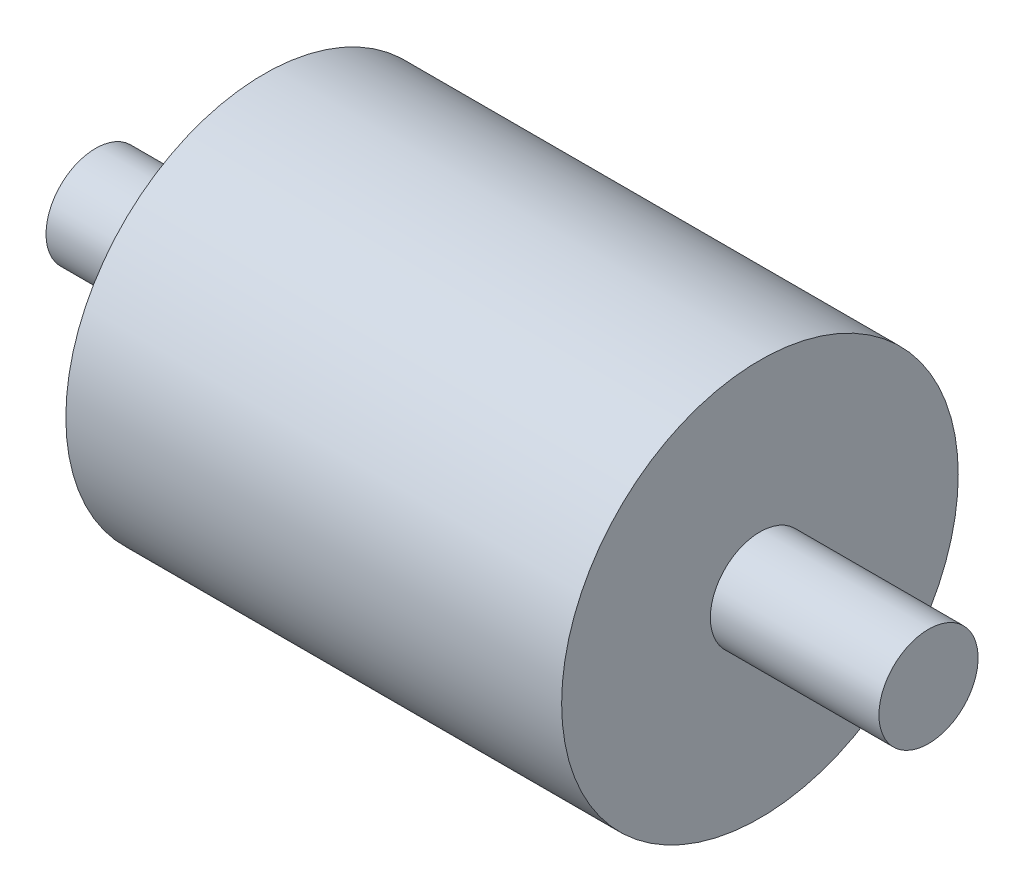
ISO-10303-21;
HEADER;
FILE_DESCRIPTION(('STEP AP214'),'2;1');
FILE_NAME('part.step','',(''),(''),'','','');
FILE_SCHEMA(('AUTOMOTIVE_DESIGN { 1 0 10303 214 1 1 1 1 }'));
ENDSEC;
DATA;
#1=APPLICATION_CONTEXT('core data for automotive mechanical design processes');
#2=APPLICATION_PROTOCOL_DEFINITION('international standard','automotive_design',2000,#1);
#3=PRODUCT_CONTEXT('',#1,'mechanical');
#4=PRODUCT('Part','Part','',(#3));
#5=PRODUCT_RELATED_PRODUCT_CATEGORY('part','',(#4));
#6=PRODUCT_DEFINITION_FORMATION('','',#4);
#7=PRODUCT_DEFINITION_CONTEXT('part definition',#1,'design');
#8=PRODUCT_DEFINITION('design','',#6,#7);
#9=PRODUCT_DEFINITION_SHAPE('','',#8);
#10=(LENGTH_UNIT() NAMED_UNIT(*) SI_UNIT(.MILLI.,.METRE.));
#11=(NAMED_UNIT(*) PLANE_ANGLE_UNIT() SI_UNIT($,.RADIAN.));
#12=(NAMED_UNIT(*) SI_UNIT($,.STERADIAN.) SOLID_ANGLE_UNIT());
#13=UNCERTAINTY_MEASURE_WITH_UNIT(LENGTH_MEASURE(1.E-05),#10,'distance_accuracy_value','');
#14=(GEOMETRIC_REPRESENTATION_CONTEXT(3) GLOBAL_UNCERTAINTY_ASSIGNED_CONTEXT((#13)) GLOBAL_UNIT_ASSIGNED_CONTEXT((#10,
#11,#12)) REPRESENTATION_CONTEXT('',''));
#15=CARTESIAN_POINT('',(0.,0.,0.));
#16=DIRECTION('',(0.,0.,1.));
#17=DIRECTION('',(1.,0.,0.));
#18=AXIS2_PLACEMENT_3D('',#15,#16,#17);
#19=CARTESIAN_POINT('',(25.,0.,0.));
#20=DIRECTION('',(-1.,0.,0.));
#21=DIRECTION('',(0.,0.,1.));
#22=AXIS2_PLACEMENT_3D('',#19,#20,#21);
#23=CYLINDRICAL_SURFACE('',#22,20.);
#24=CARTESIAN_POINT('',(25.,0.,0.));
#25=DIRECTION('',(1.,0.,0.));
#26=DIRECTION('',(0.,0.,-1.));
#27=AXIS2_PLACEMENT_3D('',#24,#25,#26);
#28=CIRCLE('',#27,20.);
#29=CARTESIAN_POINT('',(25.,0.,-20.));
#30=VERTEX_POINT('',#29);
#31=EDGE_CURVE('E44',#30,#30,#28,.T.);
#32=ORIENTED_EDGE('',*,*,#31,.F.);
#33=EDGE_LOOP('',(#32));
#34=FACE_BOUND('',#33,.T.);
#35=CARTESIAN_POINT('',(-25.,0.,0.));
#36=DIRECTION('',(1.,0.,0.));
#37=DIRECTION('',(0.,0.,-1.));
#38=AXIS2_PLACEMENT_3D('',#35,#36,#37);
#39=CIRCLE('',#38,20.);
#40=CARTESIAN_POINT('',(-25.,0.,-20.));
#41=VERTEX_POINT('',#40);
#42=EDGE_CURVE('E49',#41,#41,#39,.T.);
#43=ORIENTED_EDGE('',*,*,#42,.T.);
#44=EDGE_LOOP('',(#43));
#45=FACE_BOUND('',#44,.T.);
#46=ADVANCED_FACE('F37',(#34,#45),#23,.T.);
#47=CARTESIAN_POINT('',(25.,0.,0.));
#48=DIRECTION('',(1.,0.,0.));
#49=DIRECTION('',(0.,0.,-1.));
#50=AXIS2_PLACEMENT_3D('',#47,#48,#49);
#51=PLANE('',#50);
#52=CARTESIAN_POINT('',(25.,0.,0.));
#53=DIRECTION('',(1.,0.,0.));
#54=DIRECTION('',(0.,0.,-1.));
#55=AXIS2_PLACEMENT_3D('',#52,#53,#54);
#56=CIRCLE('',#55,5.);
#57=CARTESIAN_POINT('',(25.,0.,5.));
#58=VERTEX_POINT('',#57);
#59=EDGE_CURVE('E55',#58,#58,#56,.F.);
#60=ORIENTED_EDGE('',*,*,#59,.T.);
#61=EDGE_LOOP('',(#60));
#62=FACE_BOUND('',#61,.T.);
#63=ORIENTED_EDGE('',*,*,#31,.T.);
#64=EDGE_LOOP('',(#63));
#65=FACE_BOUND('',#64,.T.);
#66=ADVANCED_FACE('F87',(#62,#65),#51,.T.);
#67=CARTESIAN_POINT('',(-25.,0.,0.));
#68=DIRECTION('',(1.,0.,0.));
#69=DIRECTION('',(0.,0.,-1.));
#70=AXIS2_PLACEMENT_3D('',#67,#68,#69);
#71=PLANE('',#70);
#72=CARTESIAN_POINT('',(-25.,0.,0.));
#73=DIRECTION('',(1.,0.,0.));
#74=DIRECTION('',(0.,0.,-1.));
#75=AXIS2_PLACEMENT_3D('',#72,#73,#74);
#76=CIRCLE('',#75,5.);
#77=CARTESIAN_POINT('',(-25.,0.,5.));
#78=VERTEX_POINT('',#77);
#79=EDGE_CURVE('E10',#78,#78,#76,.F.);
#80=ORIENTED_EDGE('',*,*,#79,.F.);
#81=EDGE_LOOP('',(#80));
#82=FACE_BOUND('',#81,.T.);
#83=ORIENTED_EDGE('',*,*,#42,.F.);
#84=EDGE_LOOP('',(#83));
#85=FACE_BOUND('',#84,.T.);
#86=ADVANCED_FACE('F92',(#82,#85),#71,.F.);
#87=CARTESIAN_POINT('',(-42.,0.,0.));
#88=DIRECTION('',(1.,0.,0.));
#89=DIRECTION('',(0.,0.,-1.));
#90=AXIS2_PLACEMENT_3D('',#87,#88,#89);
#91=PLANE('',#90);
#92=CARTESIAN_POINT('',(-42.,0.,0.));
#93=DIRECTION('',(1.,0.,0.));
#94=DIRECTION('',(0.,0.,-1.));
#95=AXIS2_PLACEMENT_3D('',#92,#93,#94);
#96=CIRCLE('',#95,5.);
#97=CARTESIAN_POINT('',(-42.,0.,5.));
#98=VERTEX_POINT('',#97);
#99=EDGE_CURVE('E61',#98,#98,#96,.T.);
#100=ORIENTED_EDGE('',*,*,#99,.F.);
#101=EDGE_LOOP('',(#100));
#102=FACE_BOUND('',#101,.T.);
#103=ADVANCED_FACE('F81',(#102),#91,.F.);
#104=CARTESIAN_POINT('',(42.,0.,0.));
#105=DIRECTION('',(-1.,0.,0.));
#106=DIRECTION('',(0.,0.,1.));
#107=AXIS2_PLACEMENT_3D('',#104,#105,#106);
#108=CYLINDRICAL_SURFACE('',#107,5.);
#109=CARTESIAN_POINT('',(-42.,0.,5.));
#110=CARTESIAN_POINT('',(-41.8229166666667,0.,5.));
#111=CARTESIAN_POINT('',(-41.6458333333333,0.,5.));
#112=CARTESIAN_POINT('',(-41.2916666666667,0.,5.));
#113=CARTESIAN_POINT('',(-41.1145833333333,0.,5.));
#114=CARTESIAN_POINT('',(-40.7604166666667,0.,5.));
#115=CARTESIAN_POINT('',(-40.5833333333333,0.,5.));
#116=CARTESIAN_POINT('',(-40.2291666666667,0.,5.));
#117=CARTESIAN_POINT('',(-40.0520833333333,0.,5.));
#118=CARTESIAN_POINT('',(-39.6979166666667,0.,5.));
#119=CARTESIAN_POINT('',(-39.5208333333333,0.,5.));
#120=CARTESIAN_POINT('',(-39.1666666666667,0.,5.));
#121=CARTESIAN_POINT('',(-38.9895833333333,0.,5.));
#122=CARTESIAN_POINT('',(-38.6354166666667,0.,5.));
#123=CARTESIAN_POINT('',(-38.4583333333333,0.,5.));
#124=CARTESIAN_POINT('',(-38.1041666666667,0.,5.));
#125=CARTESIAN_POINT('',(-37.9270833333333,0.,5.));
#126=CARTESIAN_POINT('',(-37.5729166666667,0.,5.));
#127=CARTESIAN_POINT('',(-37.3958333333333,0.,5.));
#128=CARTESIAN_POINT('',(-37.0416666666667,0.,5.));
#129=CARTESIAN_POINT('',(-36.8645833333333,0.,5.));
#130=CARTESIAN_POINT('',(-36.5104166666667,0.,5.));
#131=CARTESIAN_POINT('',(-36.3333333333333,0.,5.));
#132=CARTESIAN_POINT('',(-35.9791666666667,0.,5.));
#133=CARTESIAN_POINT('',(-35.8020833333333,0.,5.));
#134=CARTESIAN_POINT('',(-35.4479166666667,0.,5.));
#135=CARTESIAN_POINT('',(-35.2708333333333,0.,5.));
#136=CARTESIAN_POINT('',(-34.9166666666667,0.,5.));
#137=CARTESIAN_POINT('',(-34.7395833333333,0.,5.));
#138=CARTESIAN_POINT('',(-34.3854166666667,0.,5.));
#139=CARTESIAN_POINT('',(-34.2083333333333,0.,5.));
#140=CARTESIAN_POINT('',(-33.8541666666667,0.,5.));
#141=CARTESIAN_POINT('',(-33.6770833333333,0.,5.));
#142=CARTESIAN_POINT('',(-33.3229166666667,0.,5.));
#143=CARTESIAN_POINT('',(-33.1458333333333,0.,5.));
#144=CARTESIAN_POINT('',(-32.7916666666667,0.,5.));
#145=CARTESIAN_POINT('',(-32.6145833333333,0.,5.));
#146=CARTESIAN_POINT('',(-32.2604166666667,0.,5.));
#147=CARTESIAN_POINT('',(-32.0833333333333,0.,5.));
#148=CARTESIAN_POINT('',(-31.7291666666667,0.,5.));
#149=CARTESIAN_POINT('',(-31.5520833333333,0.,5.));
#150=CARTESIAN_POINT('',(-31.1979166666667,0.,5.));
#151=CARTESIAN_POINT('',(-31.0208333333333,0.,5.));
#152=CARTESIAN_POINT('',(-30.6666666666667,0.,5.));
#153=CARTESIAN_POINT('',(-30.4895833333333,0.,5.));
#154=CARTESIAN_POINT('',(-30.1354166666667,0.,5.));
#155=CARTESIAN_POINT('',(-29.9583333333333,0.,5.));
#156=CARTESIAN_POINT('',(-29.6041666666667,0.,5.));
#157=CARTESIAN_POINT('',(-29.4270833333333,0.,5.));
#158=CARTESIAN_POINT('',(-29.0729166666667,0.,5.));
#159=CARTESIAN_POINT('',(-28.8958333333333,0.,5.));
#160=CARTESIAN_POINT('',(-28.5416666666667,0.,5.));
#161=CARTESIAN_POINT('',(-28.3645833333333,0.,5.));
#162=CARTESIAN_POINT('',(-28.0104166666667,0.,5.));
#163=CARTESIAN_POINT('',(-27.8333333333333,0.,5.));
#164=CARTESIAN_POINT('',(-27.4791666666667,0.,5.));
#165=CARTESIAN_POINT('',(-27.3020833333333,0.,5.));
#166=CARTESIAN_POINT('',(-26.9479166666667,0.,5.));
#167=CARTESIAN_POINT('',(-26.7708333333333,0.,5.));
#168=CARTESIAN_POINT('',(-26.4166666666667,0.,5.));
#169=CARTESIAN_POINT('',(-26.2395833333333,0.,5.));
#170=CARTESIAN_POINT('',(-25.8854166666667,0.,5.));
#171=CARTESIAN_POINT('',(-25.7083333333333,0.,5.));
#172=CARTESIAN_POINT('',(-25.3541666666667,0.,5.));
#173=CARTESIAN_POINT('',(-25.1770833333333,0.,5.));
#174=CARTESIAN_POINT('',(-25.,0.,5.));
#175=B_SPLINE_CURVE_WITH_KNOTS('',3,(#109,#110,#111,#112,#113,#114,#115,#116,#117,#118,#119,
#120,#121,#122,#123,#124,#125,#126,#127,#128,#129,#130,#131,#132,#133,#134,#135,#136,#137,#138,
#139,#140,#141,#142,#143,#144,#145,#146,#147,#148,#149,#150,#151,#152,#153,#154,#155,#156,#157,
#158,#159,#160,#161,#162,#163,#164,#165,#166,#167,#168,#169,#170,#171,#172,#173,#174),
.UNSPECIFIED.,.F.,.F.,(4,2,2,2,2,2,2,2,2,2,2,2,2,2,2,2,2,2,2,2,2,2,2,2,2,2,2,2,2,2,2,2,4),(0.,
0.531249999999997,1.06249999999999,1.59375,2.125,2.65625,3.1875,3.71874999999999,4.25,4.78125,
5.3125,5.84374999999999,6.37499999999999,6.90624999999999,7.4375,7.96875,8.49999999999999,
9.03124999999999,9.56249999999999,10.09375,10.625,11.15625,11.6875,12.21875,12.75,13.28125,
13.8125,14.34375,14.875,15.40625,15.9375,16.46875,17.),.UNSPECIFIED.);
#176=EDGE_CURVE('BSEAM73',#98,#78,#175,.T.);
#177=ORIENTED_EDGE('',*,*,#99,.T.);
#178=ORIENTED_EDGE('',*,*,#79,.T.);
#179=ORIENTED_EDGE('',*,*,#176,.T.);
#180=ORIENTED_EDGE('',*,*,#176,.F.);
#181=EDGE_LOOP('',(#177,#179,#178,#180));
#182=FACE_BOUND('',#181,.T.);
#183=ADVANCED_FACE('F73',(#182),#108,.T.);
#184=CARTESIAN_POINT('',(42.,0.,0.));
#185=DIRECTION('',(1.,0.,0.));
#186=DIRECTION('',(0.,0.,-1.));
#187=AXIS2_PLACEMENT_3D('',#184,#185,#186);
#188=CIRCLE('',#187,5.);
#189=CARTESIAN_POINT('',(42.,0.,5.));
#190=VERTEX_POINT('',#189);
#191=EDGE_CURVE('E60',#190,#190,#188,.T.);
#192=CARTESIAN_POINT('',(25.,0.,5.));
#193=CARTESIAN_POINT('',(25.1770833333333,0.,5.));
#194=CARTESIAN_POINT('',(25.3541666666667,0.,5.));
#195=CARTESIAN_POINT('',(25.7083333333333,0.,5.));
#196=CARTESIAN_POINT('',(25.8854166666667,0.,5.));
#197=CARTESIAN_POINT('',(26.2395833333333,0.,5.));
#198=CARTESIAN_POINT('',(26.4166666666667,0.,5.));
#199=CARTESIAN_POINT('',(26.7708333333333,0.,5.));
#200=CARTESIAN_POINT('',(26.9479166666667,0.,5.));
#201=CARTESIAN_POINT('',(27.3020833333333,0.,5.));
#202=CARTESIAN_POINT('',(27.4791666666667,0.,5.));
#203=CARTESIAN_POINT('',(27.8333333333333,0.,5.));
#204=CARTESIAN_POINT('',(28.0104166666667,0.,5.));
#205=CARTESIAN_POINT('',(28.3645833333333,0.,5.));
#206=CARTESIAN_POINT('',(28.5416666666667,0.,5.));
#207=CARTESIAN_POINT('',(28.8958333333333,0.,5.));
#208=CARTESIAN_POINT('',(29.0729166666667,0.,5.));
#209=CARTESIAN_POINT('',(29.4270833333333,0.,5.));
#210=CARTESIAN_POINT('',(29.6041666666667,0.,5.));
#211=CARTESIAN_POINT('',(29.9583333333333,0.,5.));
#212=CARTESIAN_POINT('',(30.1354166666667,0.,5.));
#213=CARTESIAN_POINT('',(30.4895833333333,0.,5.));
#214=CARTESIAN_POINT('',(30.6666666666667,0.,5.));
#215=CARTESIAN_POINT('',(31.0208333333333,0.,5.));
#216=CARTESIAN_POINT('',(31.1979166666667,0.,5.));
#217=CARTESIAN_POINT('',(31.5520833333333,0.,5.));
#218=CARTESIAN_POINT('',(31.7291666666667,0.,5.));
#219=CARTESIAN_POINT('',(32.0833333333333,0.,5.));
#220=CARTESIAN_POINT('',(32.2604166666667,0.,5.));
#221=CARTESIAN_POINT('',(32.6145833333333,0.,5.));
#222=CARTESIAN_POINT('',(32.7916666666667,0.,5.));
#223=CARTESIAN_POINT('',(33.1458333333333,0.,5.));
#224=CARTESIAN_POINT('',(33.3229166666667,0.,5.));
#225=CARTESIAN_POINT('',(33.6770833333333,0.,5.));
#226=CARTESIAN_POINT('',(33.8541666666667,0.,5.));
#227=CARTESIAN_POINT('',(34.2083333333333,0.,5.));
#228=CARTESIAN_POINT('',(34.3854166666667,0.,5.));
#229=CARTESIAN_POINT('',(34.7395833333333,0.,5.));
#230=CARTESIAN_POINT('',(34.9166666666667,0.,5.));
#231=CARTESIAN_POINT('',(35.2708333333333,0.,5.));
#232=CARTESIAN_POINT('',(35.4479166666667,0.,5.));
#233=CARTESIAN_POINT('',(35.8020833333333,0.,5.));
#234=CARTESIAN_POINT('',(35.9791666666667,0.,5.));
#235=CARTESIAN_POINT('',(36.3333333333333,0.,5.));
#236=CARTESIAN_POINT('',(36.5104166666667,0.,5.));
#237=CARTESIAN_POINT('',(36.8645833333333,0.,5.));
#238=CARTESIAN_POINT('',(37.0416666666667,0.,5.));
#239=CARTESIAN_POINT('',(37.3958333333333,0.,5.));
#240=CARTESIAN_POINT('',(37.5729166666667,0.,5.));
#241=CARTESIAN_POINT('',(37.9270833333333,0.,5.));
#242=CARTESIAN_POINT('',(38.1041666666667,0.,5.));
#243=CARTESIAN_POINT('',(38.4583333333333,0.,5.));
#244=CARTESIAN_POINT('',(38.6354166666667,0.,5.));
#245=CARTESIAN_POINT('',(38.9895833333333,0.,5.));
#246=CARTESIAN_POINT('',(39.1666666666667,0.,5.));
#247=CARTESIAN_POINT('',(39.5208333333333,0.,5.));
#248=CARTESIAN_POINT('',(39.6979166666667,0.,5.));
#249=CARTESIAN_POINT('',(40.0520833333333,0.,5.));
#250=CARTESIAN_POINT('',(40.2291666666667,0.,5.));
#251=CARTESIAN_POINT('',(40.5833333333333,0.,5.));
#252=CARTESIAN_POINT('',(40.7604166666667,0.,5.));
#253=CARTESIAN_POINT('',(41.1145833333333,0.,5.));
#254=CARTESIAN_POINT('',(41.2916666666667,0.,5.));
#255=CARTESIAN_POINT('',(41.6458333333333,0.,5.));
#256=CARTESIAN_POINT('',(41.8229166666667,0.,5.));
#257=CARTESIAN_POINT('',(42.,0.,5.));
#258=B_SPLINE_CURVE_WITH_KNOTS('',3,(#192,#193,#194,#195,#196,#197,#198,#199,#200,#201,#202,
#203,#204,#205,#206,#207,#208,#209,#210,#211,#212,#213,#214,#215,#216,#217,#218,#219,#220,#221,
#222,#223,#224,#225,#226,#227,#228,#229,#230,#231,#232,#233,#234,#235,#236,#237,#238,#239,#240,
#241,#242,#243,#244,#245,#246,#247,#248,#249,#250,#251,#252,#253,#254,#255,#256,#257),
.UNSPECIFIED.,.F.,.F.,(4,2,2,2,2,2,2,2,2,2,2,2,2,2,2,2,2,2,2,2,2,2,2,2,2,2,2,2,2,2,2,2,4),(0.,
0.53125,1.0625,1.59375,2.125,2.65625,3.1875,3.71875,4.25,4.78125,5.3125,5.84375,6.375,6.90625,
7.4375,7.96875,8.5,9.03125,9.5625,10.09375,10.625,11.15625,11.6875,12.21875,12.75,13.28125,
13.8125,14.34375,14.875,15.40625,15.9375,16.46875,17.),.UNSPECIFIED.);
#259=EDGE_CURVE('BSEAM71',#58,#190,#258,.T.);
#260=ORIENTED_EDGE('',*,*,#59,.F.);
#261=ORIENTED_EDGE('',*,*,#191,.F.);
#262=ORIENTED_EDGE('',*,*,#259,.T.);
#263=ORIENTED_EDGE('',*,*,#259,.F.);
#264=EDGE_LOOP('',(#260,#262,#261,#263));
#265=FACE_BOUND('',#264,.T.);
#266=ADVANCED_FACE('F71',(#265),#108,.T.);
#267=CARTESIAN_POINT('',(42.,0.,0.));
#268=DIRECTION('',(1.,0.,0.));
#269=DIRECTION('',(0.,0.,-1.));
#270=AXIS2_PLACEMENT_3D('',#267,#268,#269);
#271=PLANE('',#270);
#272=ORIENTED_EDGE('',*,*,#191,.T.);
#273=EDGE_LOOP('',(#272));
#274=FACE_BOUND('',#273,.T.);
#275=ADVANCED_FACE('F69',(#274),#271,.T.);
#276=CLOSED_SHELL('',(#46,#66,#86,#103,#183,#266,#275));
#277=MANIFOLD_SOLID_BREP('B2',#276);
#278=ADVANCED_BREP_SHAPE_REPRESENTATION('',(#18,#277),#14);
#279=SHAPE_DEFINITION_REPRESENTATION(#9,#278);
ENDSEC;
END-ISO-10303-21;
